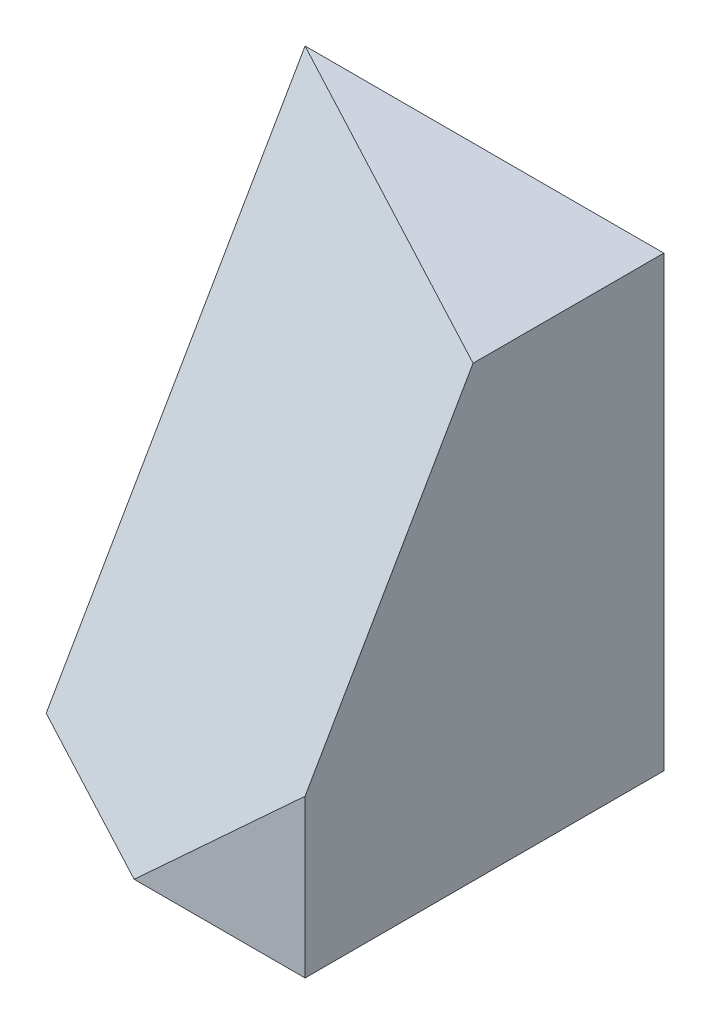
ISO-10303-21;
HEADER;
FILE_DESCRIPTION(('STEP AP214'),'2;1');
FILE_NAME('part.step','',(''),(''),'','','');
FILE_SCHEMA(('AUTOMOTIVE_DESIGN { 1 0 10303 214 1 1 1 1 }'));
ENDSEC;
DATA;
#1=APPLICATION_CONTEXT('core data for automotive mechanical design processes');
#2=APPLICATION_PROTOCOL_DEFINITION('international standard','automotive_design',2000,#1);
#3=PRODUCT_CONTEXT('',#1,'mechanical');
#4=PRODUCT('Part','Part','',(#3));
#5=PRODUCT_RELATED_PRODUCT_CATEGORY('part','',(#4));
#6=PRODUCT_DEFINITION_FORMATION('','',#4);
#7=PRODUCT_DEFINITION_CONTEXT('part definition',#1,'design');
#8=PRODUCT_DEFINITION('design','',#6,#7);
#9=PRODUCT_DEFINITION_SHAPE('','',#8);
#10=(LENGTH_UNIT() NAMED_UNIT(*) SI_UNIT(.MILLI.,.METRE.));
#11=(NAMED_UNIT(*) PLANE_ANGLE_UNIT() SI_UNIT($,.RADIAN.));
#12=(NAMED_UNIT(*) SI_UNIT($,.STERADIAN.) SOLID_ANGLE_UNIT());
#13=UNCERTAINTY_MEASURE_WITH_UNIT(LENGTH_MEASURE(1.E-05),#10,'distance_accuracy_value','');
#14=(GEOMETRIC_REPRESENTATION_CONTEXT(3) GLOBAL_UNCERTAINTY_ASSIGNED_CONTEXT((#13)) GLOBAL_UNIT_ASSIGNED_CONTEXT((#10,
#11,#12)) REPRESENTATION_CONTEXT('',''));
#15=CARTESIAN_POINT('',(0.,0.,0.));
#16=DIRECTION('',(0.,0.,1.));
#17=DIRECTION('',(1.,0.,0.));
#18=AXIS2_PLACEMENT_3D('',#15,#16,#17);
#19=CARTESIAN_POINT('',(24.,60.,-24.));
#20=DIRECTION('',(-1.,0.,0.));
#21=DIRECTION('',(0.,0.,1.));
#22=AXIS2_PLACEMENT_3D('',#19,#20,#21);
#23=PLANE('',#22);
#24=DIRECTION('',(0.,0.,-1.));
#25=VECTOR('',#24,1.);
#26=CARTESIAN_POINT('',(24.,60.,-24.));
#27=LINE('',#26,#25);
#28=CARTESIAN_POINT('',(24.,60.,1.52205271975123));
#29=VERTEX_POINT('',#28);
#30=CARTESIAN_POINT('',(24.,60.,-24.));
#31=VERTEX_POINT('',#30);
#32=EDGE_CURVE('E63',#29,#31,#27,.T.);
#33=ORIENTED_EDGE('',*,*,#32,.F.);
#34=DIRECTION('',(0.,-0.866025403784436,0.500000000000004));
#35=VECTOR('',#34,1.);
#36=CARTESIAN_POINT('',(24.,71.0513730060152,-4.85846046018668));
#37=LINE('',#36,#35);
#38=CARTESIAN_POINT('',(24.,21.0670532607549,24.));
#39=VERTEX_POINT('',#38);
#40=EDGE_CURVE('E121',#29,#39,#37,.T.);
#41=ORIENTED_EDGE('',*,*,#40,.T.);
#42=DIRECTION('',(0.,-1.,0.));
#43=VECTOR('',#42,1.);
#44=CARTESIAN_POINT('',(24.,60.,24.));
#45=LINE('',#44,#43);
#46=CARTESIAN_POINT('',(24.,0.,24.));
#47=VERTEX_POINT('',#46);
#48=EDGE_CURVE('E96',#39,#47,#45,.T.);
#49=ORIENTED_EDGE('',*,*,#48,.T.);
#50=DIRECTION('',(0.,0.,-1.));
#51=VECTOR('',#50,1.);
#52=CARTESIAN_POINT('',(24.,0.,-24.));
#53=LINE('',#52,#51);
#54=CARTESIAN_POINT('',(24.,0.,-24.));
#55=VERTEX_POINT('',#54);
#56=EDGE_CURVE('E90',#47,#55,#53,.T.);
#57=ORIENTED_EDGE('',*,*,#56,.T.);
#58=DIRECTION('',(0.,-1.,0.));
#59=VECTOR('',#58,1.);
#60=CARTESIAN_POINT('',(24.,60.,-24.));
#61=LINE('',#60,#59);
#62=EDGE_CURVE('E48',#31,#55,#61,.T.);
#63=ORIENTED_EDGE('',*,*,#62,.F.);
#64=EDGE_LOOP('',(#33,#41,#49,#57,#63));
#65=FACE_BOUND('',#64,.T.);
#66=ADVANCED_FACE('F40',(#65),#23,.F.);
#67=CARTESIAN_POINT('',(-24.,60.,-24.));
#68=DIRECTION('',(0.,0.,1.));
#69=DIRECTION('',(1.,0.,0.));
#70=AXIS2_PLACEMENT_3D('',#67,#68,#69);
#71=PLANE('',#70);
#72=DIRECTION('',(-1.,0.,0.));
#73=VECTOR('',#72,1.);
#74=CARTESIAN_POINT('',(-24.,0.,-24.));
#75=LINE('',#74,#73);
#76=CARTESIAN_POINT('',(-24.,0.,-24.));
#77=VERTEX_POINT('',#76);
#78=EDGE_CURVE('E78',#55,#77,#75,.T.);
#79=ORIENTED_EDGE('',*,*,#78,.T.);
#80=DIRECTION('',(0.,-1.,0.));
#81=VECTOR('',#80,1.);
#82=CARTESIAN_POINT('',(-24.,60.,-24.));
#83=LINE('',#82,#81);
#84=CARTESIAN_POINT('',(-24.,60.,-24.));
#85=VERTEX_POINT('',#84);
#86=EDGE_CURVE('E82',#85,#77,#83,.T.);
#87=ORIENTED_EDGE('',*,*,#86,.F.);
#88=DIRECTION('',(-1.,0.,0.));
#89=VECTOR('',#88,1.);
#90=CARTESIAN_POINT('',(-24.,60.,-24.));
#91=LINE('',#90,#89);
#92=EDGE_CURVE('E109',#31,#85,#91,.T.);
#93=ORIENTED_EDGE('',*,*,#92,.F.);
#94=ORIENTED_EDGE('',*,*,#62,.T.);
#95=EDGE_LOOP('',(#79,#87,#93,#94));
#96=FACE_BOUND('',#95,.T.);
#97=ADVANCED_FACE('F80',(#96),#71,.F.);
#98=CARTESIAN_POINT('',(-24.,60.,-24.));
#99=DIRECTION('',(1.,0.,0.));
#100=DIRECTION('',(0.,0.,-1.));
#101=AXIS2_PLACEMENT_3D('',#98,#99,#100);
#102=PLANE('',#101);
#103=DIRECTION('',(0.,0.,1.));
#104=VECTOR('',#103,1.);
#105=CARTESIAN_POINT('',(-24.,0.,-24.));
#106=LINE('',#105,#104);
#107=CARTESIAN_POINT('',(-24.,0.,10.6410161513779));
#108=VERTEX_POINT('',#107);
#109=EDGE_CURVE('E89',#77,#108,#106,.T.);
#110=ORIENTED_EDGE('',*,*,#109,.T.);
#111=DIRECTION('',(0.,0.866025403784436,-0.500000000000004));
#112=VECTOR('',#111,1.);
#113=CARTESIAN_POINT('',(-24.,60.,-24.));
#114=LINE('',#113,#112);
#115=EDGE_CURVE('E55',#108,#85,#114,.T.);
#116=ORIENTED_EDGE('',*,*,#115,.T.);
#117=ORIENTED_EDGE('',*,*,#86,.T.);
#118=EDGE_LOOP('',(#110,#116,#117));
#119=FACE_BOUND('',#118,.T.);
#120=ADVANCED_FACE('F94',(#119),#102,.F.);
#121=CARTESIAN_POINT('',(-24.,60.,24.));
#122=DIRECTION('',(0.,0.,-1.));
#123=DIRECTION('',(-1.,0.,0.));
#124=AXIS2_PLACEMENT_3D('',#121,#122,#123);
#125=PLANE('',#124);
#126=ORIENTED_EDGE('',*,*,#48,.F.);
#127=DIRECTION('',(-0.735583548297665,-0.677434014110464,0.));
#128=VECTOR('',#127,1.);
#129=CARTESIAN_POINT('',(17.4286585398911,15.015191125292,24.));
#130=LINE('',#129,#128);
#131=CARTESIAN_POINT('',(1.1245944742375,0.,24.));
#132=VERTEX_POINT('',#131);
#133=EDGE_CURVE('E128',#39,#132,#130,.T.);
#134=ORIENTED_EDGE('',*,*,#133,.T.);
#135=DIRECTION('',(1.,0.,0.));
#136=VECTOR('',#135,1.);
#137=CARTESIAN_POINT('',(-24.,0.,24.));
#138=LINE('',#137,#136);
#139=EDGE_CURVE('E101',#132,#47,#138,.T.);
#140=ORIENTED_EDGE('',*,*,#139,.T.);
#141=EDGE_LOOP('',(#126,#134,#140));
#142=FACE_BOUND('',#141,.T.);
#143=ADVANCED_FACE('F136',(#142),#125,.F.);
#144=CARTESIAN_POINT('',(0.,60.,0.));
#145=DIRECTION('',(0.,1.,0.));
#146=DIRECTION('',(0.,0.,1.));
#147=AXIS2_PLACEMENT_3D('',#144,#145,#146);
#148=PLANE('',#147);
#149=DIRECTION('',(-0.882947592858925,0.,-0.469471562785895));
#150=VECTOR('',#149,1.);
#151=CARTESIAN_POINT('',(4.65876571230944,60.,-8.76186397098832));
#152=LINE('',#151,#150);
#153=EDGE_CURVE('E116',#29,#85,#152,.T.);
#154=ORIENTED_EDGE('',*,*,#153,.F.);
#155=ORIENTED_EDGE('',*,*,#32,.T.);
#156=ORIENTED_EDGE('',*,*,#92,.T.);
#157=EDGE_LOOP('',(#154,#155,#156));
#158=FACE_BOUND('',#157,.T.);
#159=ADVANCED_FACE('F140',(#158),#148,.T.);
#160=CARTESIAN_POINT('',(0.,0.,0.));
#161=DIRECTION('',(0.,1.,0.));
#162=DIRECTION('',(0.,0.,1.));
#163=AXIS2_PLACEMENT_3D('',#160,#161,#162);
#164=PLANE('',#163);
#165=ORIENTED_EDGE('',*,*,#139,.F.);
#166=DIRECTION('',(-0.882947592858925,0.,-0.469471562785895));
#167=VECTOR('',#166,1.);
#168=CARTESIAN_POINT('',(-9.70058625817982,0.,18.2441493051335));
#169=LINE('',#168,#167);
#170=EDGE_CURVE('E12',#132,#108,#169,.T.);
#171=ORIENTED_EDGE('',*,*,#170,.T.);
#172=ORIENTED_EDGE('',*,*,#109,.F.);
#173=ORIENTED_EDGE('',*,*,#78,.F.);
#174=ORIENTED_EDGE('',*,*,#56,.F.);
#175=EDGE_LOOP('',(#165,#171,#172,#173,#174));
#176=FACE_BOUND('',#175,.T.);
#177=ADVANCED_FACE('F99',(#176),#164,.F.);
#178=CARTESIAN_POINT('',(-7.6996999934153,8.36062631047692,14.481029552843));
#179=DIRECTION('',(0.418260836817549,-0.454163481684926,-0.786634225220661));
#180=DIRECTION('',(0.,0.866025403784436,-0.500000000000004));
#181=AXIS2_PLACEMENT_3D('',#178,#179,#180);
#182=PLANE('',#181);
#183=ORIENTED_EDGE('',*,*,#40,.F.);
#184=ORIENTED_EDGE('',*,*,#153,.T.);
#185=ORIENTED_EDGE('',*,*,#115,.F.);
#186=ORIENTED_EDGE('',*,*,#170,.F.);
#187=ORIENTED_EDGE('',*,*,#133,.F.);
#188=EDGE_LOOP('',(#183,#184,#185,#186,#187));
#189=FACE_BOUND('',#188,.T.);
#190=ADVANCED_FACE('F138',(#189),#182,.F.);
#191=CLOSED_SHELL('',(#66,#97,#120,#143,#159,#177,#190));
#192=MANIFOLD_SOLID_BREP('B2',#191);
#193=ADVANCED_BREP_SHAPE_REPRESENTATION('',(#18,#192),#14);
#194=SHAPE_DEFINITION_REPRESENTATION(#9,#193);
ENDSEC;
END-ISO-10303-21;
